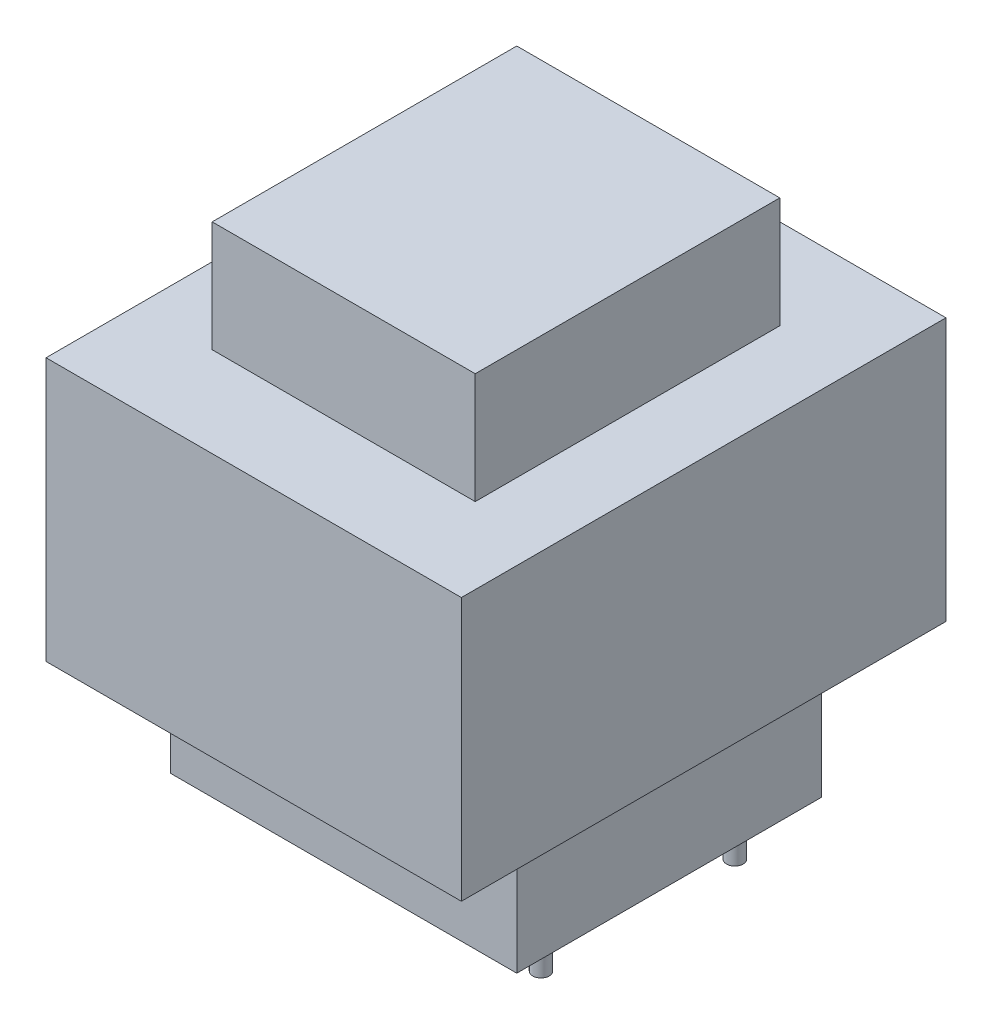
ISO-10303-21;
HEADER;
FILE_DESCRIPTION(('STEP AP214'),'2;1');
FILE_NAME('part.step','',(''),(''),'','','');
FILE_SCHEMA(('AUTOMOTIVE_DESIGN { 1 0 10303 214 1 1 1 1 }'));
ENDSEC;
DATA;
#1=APPLICATION_CONTEXT('core data for automotive mechanical design processes');
#2=APPLICATION_PROTOCOL_DEFINITION('international standard','automotive_design',2000,#1);
#3=PRODUCT_CONTEXT('',#1,'mechanical');
#4=PRODUCT('Part','Part','',(#3));
#5=PRODUCT_RELATED_PRODUCT_CATEGORY('part','',(#4));
#6=PRODUCT_DEFINITION_FORMATION('','',#4);
#7=PRODUCT_DEFINITION_CONTEXT('part definition',#1,'design');
#8=PRODUCT_DEFINITION('design','',#6,#7);
#9=PRODUCT_DEFINITION_SHAPE('','',#8);
#10=(LENGTH_UNIT() NAMED_UNIT(*) SI_UNIT(.MILLI.,.METRE.));
#11=(NAMED_UNIT(*) PLANE_ANGLE_UNIT() SI_UNIT($,.RADIAN.));
#12=(NAMED_UNIT(*) SI_UNIT($,.STERADIAN.) SOLID_ANGLE_UNIT());
#13=UNCERTAINTY_MEASURE_WITH_UNIT(LENGTH_MEASURE(1.E-05),#10,'distance_accuracy_value','');
#14=(GEOMETRIC_REPRESENTATION_CONTEXT(3) GLOBAL_UNCERTAINTY_ASSIGNED_CONTEXT((#13)) GLOBAL_UNIT_ASSIGNED_CONTEXT((#10,
#11,#12)) REPRESENTATION_CONTEXT('',''));
#15=CARTESIAN_POINT('',(0.,0.,0.));
#16=DIRECTION('',(0.,0.,1.));
#17=DIRECTION('',(1.,0.,0.));
#18=AXIS2_PLACEMENT_3D('',#15,#16,#17);
#19=CARTESIAN_POINT('',(-12.5,9.,-11.));
#20=DIRECTION('',(0.,0.,1.));
#21=DIRECTION('',(1.,0.,0.));
#22=AXIS2_PLACEMENT_3D('',#19,#20,#21);
#23=PLANE('',#22);
#24=DIRECTION('',(0.,-1.,0.));
#25=VECTOR('',#24,1.);
#26=CARTESIAN_POINT('',(-12.5,9.,-11.));
#27=LINE('',#26,#25);
#28=CARTESIAN_POINT('',(-12.5,9.,-11.));
#29=VERTEX_POINT('',#28);
#30=CARTESIAN_POINT('',(-12.5,0.,-11.));
#31=VERTEX_POINT('',#30);
#32=EDGE_CURVE('E43',#29,#31,#27,.T.);
#33=ORIENTED_EDGE('',*,*,#32,.F.);
#34=DIRECTION('',(-1.,0.,0.));
#35=VECTOR('',#34,1.);
#36=CARTESIAN_POINT('',(-12.5,9.,-11.));
#37=LINE('',#36,#35);
#38=CARTESIAN_POINT('',(12.5,9.,-11.));
#39=VERTEX_POINT('',#38);
#40=EDGE_CURVE('E84',#39,#29,#37,.T.);
#41=ORIENTED_EDGE('',*,*,#40,.F.);
#42=DIRECTION('',(0.,-1.,0.));
#43=VECTOR('',#42,1.);
#44=CARTESIAN_POINT('',(12.5,9.,-11.));
#45=LINE('',#44,#43);
#46=CARTESIAN_POINT('',(12.5,0.,-11.));
#47=VERTEX_POINT('',#46);
#48=EDGE_CURVE('E11',#39,#47,#45,.T.);
#49=ORIENTED_EDGE('',*,*,#48,.T.);
#50=DIRECTION('',(-1.,0.,0.));
#51=VECTOR('',#50,1.);
#52=CARTESIAN_POINT('',(-12.5,0.,-11.));
#53=LINE('',#52,#51);
#54=EDGE_CURVE('E180',#47,#31,#53,.T.);
#55=ORIENTED_EDGE('',*,*,#54,.T.);
#56=EDGE_LOOP('',(#33,#41,#49,#55));
#57=FACE_BOUND('',#56,.T.);
#58=ADVANCED_FACE('F35',(#57),#23,.F.);
#59=CARTESIAN_POINT('',(-12.5,9.,11.));
#60=DIRECTION('',(0.,0.,-1.));
#61=DIRECTION('',(-1.,0.,0.));
#62=AXIS2_PLACEMENT_3D('',#59,#60,#61);
#63=PLANE('',#62);
#64=DIRECTION('',(0.,-1.,0.));
#65=VECTOR('',#64,1.);
#66=CARTESIAN_POINT('',(12.5,9.,11.));
#67=LINE('',#66,#65);
#68=CARTESIAN_POINT('',(12.5,9.,11.));
#69=VERTEX_POINT('',#68);
#70=CARTESIAN_POINT('',(12.5,0.,11.));
#71=VERTEX_POINT('',#70);
#72=EDGE_CURVE('E177',#69,#71,#67,.T.);
#73=ORIENTED_EDGE('',*,*,#72,.F.);
#74=DIRECTION('',(1.,0.,0.));
#75=VECTOR('',#74,1.);
#76=CARTESIAN_POINT('',(-12.5,9.,11.));
#77=LINE('',#76,#75);
#78=CARTESIAN_POINT('',(-12.5,9.,11.));
#79=VERTEX_POINT('',#78);
#80=EDGE_CURVE('E175',#79,#69,#77,.T.);
#81=ORIENTED_EDGE('',*,*,#80,.F.);
#82=DIRECTION('',(0.,-1.,0.));
#83=VECTOR('',#82,1.);
#84=CARTESIAN_POINT('',(-12.5,9.,11.));
#85=LINE('',#84,#83);
#86=CARTESIAN_POINT('',(-12.5,0.,11.));
#87=VERTEX_POINT('',#86);
#88=EDGE_CURVE('E59',#79,#87,#85,.T.);
#89=ORIENTED_EDGE('',*,*,#88,.T.);
#90=DIRECTION('',(1.,0.,0.));
#91=VECTOR('',#90,1.);
#92=CARTESIAN_POINT('',(-12.5,0.,11.));
#93=LINE('',#92,#91);
#94=EDGE_CURVE('E79',#87,#71,#93,.T.);
#95=ORIENTED_EDGE('',*,*,#94,.T.);
#96=EDGE_LOOP('',(#73,#81,#89,#95));
#97=FACE_BOUND('',#96,.T.);
#98=ADVANCED_FACE('F194',(#97),#63,.F.);
#99=CARTESIAN_POINT('',(12.5,9.,11.));
#100=DIRECTION('',(-1.,0.,0.));
#101=DIRECTION('',(0.,0.,1.));
#102=AXIS2_PLACEMENT_3D('',#99,#100,#101);
#103=PLANE('',#102);
#104=DIRECTION('',(0.,0.,-1.));
#105=VECTOR('',#104,1.);
#106=CARTESIAN_POINT('',(12.5,0.,11.));
#107=LINE('',#106,#105);
#108=EDGE_CURVE('E167',#71,#47,#107,.T.);
#109=ORIENTED_EDGE('',*,*,#108,.T.);
#110=ORIENTED_EDGE('',*,*,#48,.F.);
#111=DIRECTION('',(0.,0.,-1.));
#112=VECTOR('',#111,1.);
#113=CARTESIAN_POINT('',(12.5,9.,11.));
#114=LINE('',#113,#112);
#115=EDGE_CURVE('E168',#69,#39,#114,.T.);
#116=ORIENTED_EDGE('',*,*,#115,.F.);
#117=ORIENTED_EDGE('',*,*,#72,.T.);
#118=EDGE_LOOP('',(#109,#110,#116,#117));
#119=FACE_BOUND('',#118,.T.);
#120=ADVANCED_FACE('F37',(#119),#103,.F.);
#121=CARTESIAN_POINT('',(-12.5,9.,11.));
#122=DIRECTION('',(1.,0.,0.));
#123=DIRECTION('',(0.,0.,-1.));
#124=AXIS2_PLACEMENT_3D('',#121,#122,#123);
#125=PLANE('',#124);
#126=DIRECTION('',(0.,0.,1.));
#127=VECTOR('',#126,1.);
#128=CARTESIAN_POINT('',(-12.5,0.,11.));
#129=LINE('',#128,#127);
#130=EDGE_CURVE('E182',#31,#87,#129,.T.);
#131=ORIENTED_EDGE('',*,*,#130,.T.);
#132=ORIENTED_EDGE('',*,*,#88,.F.);
#133=DIRECTION('',(0.,0.,1.));
#134=VECTOR('',#133,1.);
#135=CARTESIAN_POINT('',(-12.5,9.,11.));
#136=LINE('',#135,#134);
#137=EDGE_CURVE('E172',#29,#79,#136,.T.);
#138=ORIENTED_EDGE('',*,*,#137,.F.);
#139=ORIENTED_EDGE('',*,*,#32,.T.);
#140=EDGE_LOOP('',(#131,#132,#138,#139));
#141=FACE_BOUND('',#140,.T.);
#142=ADVANCED_FACE('F188',(#141),#125,.F.);
#143=CARTESIAN_POINT('',(0.,0.,0.));
#144=DIRECTION('',(0.,-1.,0.));
#145=DIRECTION('',(0.,0.,-1.));
#146=AXIS2_PLACEMENT_3D('',#143,#144,#145);
#147=PLANE('',#146);
#148=CARTESIAN_POINT('',(-10.25,0.,0.));
#149=DIRECTION('',(0.,-1.,0.));
#150=DIRECTION('',(0.,0.,-1.));
#151=AXIS2_PLACEMENT_3D('',#148,#149,#150);
#152=CIRCLE('',#151,0.6);
#153=CARTESIAN_POINT('',(-10.25,0.,-0.599999999999998));
#154=VERTEX_POINT('',#153);
#155=EDGE_CURVE('E272',#154,#154,#152,.T.);
#156=ORIENTED_EDGE('',*,*,#155,.F.);
#157=EDGE_LOOP('',(#156));
#158=FACE_BOUND('',#157,.T.);
#159=CARTESIAN_POINT('',(-10.25,0.,-7.));
#160=DIRECTION('',(0.,-1.,0.));
#161=DIRECTION('',(0.,0.,-1.));
#162=AXIS2_PLACEMENT_3D('',#159,#160,#161);
#163=CIRCLE('',#162,0.6);
#164=CARTESIAN_POINT('',(-10.25,0.,-7.6));
#165=VERTEX_POINT('',#164);
#166=EDGE_CURVE('E276',#165,#165,#163,.T.);
#167=ORIENTED_EDGE('',*,*,#166,.F.);
#168=EDGE_LOOP('',(#167));
#169=FACE_BOUND('',#168,.T.);
#170=CARTESIAN_POINT('',(-10.25,0.,7.));
#171=DIRECTION('',(0.,-1.,0.));
#172=DIRECTION('',(0.,0.,-1.));
#173=AXIS2_PLACEMENT_3D('',#170,#171,#172);
#174=CIRCLE('',#173,0.6);
#175=CARTESIAN_POINT('',(-10.25,0.,6.4));
#176=VERTEX_POINT('',#175);
#177=EDGE_CURVE('E282',#176,#176,#174,.T.);
#178=ORIENTED_EDGE('',*,*,#177,.F.);
#179=EDGE_LOOP('',(#178));
#180=FACE_BOUND('',#179,.T.);
#181=CARTESIAN_POINT('',(10.25,0.,7.));
#182=DIRECTION('',(0.,-1.,0.));
#183=DIRECTION('',(0.,0.,-1.));
#184=AXIS2_PLACEMENT_3D('',#181,#182,#183);
#185=CIRCLE('',#184,0.6);
#186=CARTESIAN_POINT('',(10.25,0.,6.4));
#187=VERTEX_POINT('',#186);
#188=EDGE_CURVE('E288',#187,#187,#185,.T.);
#189=ORIENTED_EDGE('',*,*,#188,.F.);
#190=EDGE_LOOP('',(#189));
#191=FACE_BOUND('',#190,.T.);
#192=CARTESIAN_POINT('',(10.25,0.,-7.));
#193=DIRECTION('',(0.,-1.,0.));
#194=DIRECTION('',(0.,0.,-1.));
#195=AXIS2_PLACEMENT_3D('',#192,#193,#194);
#196=CIRCLE('',#195,0.6);
#197=CARTESIAN_POINT('',(10.25,0.,-7.6));
#198=VERTEX_POINT('',#197);
#199=EDGE_CURVE('E235',#198,#198,#196,.T.);
#200=ORIENTED_EDGE('',*,*,#199,.F.);
#201=EDGE_LOOP('',(#200));
#202=FACE_BOUND('',#201,.T.);
#203=ORIENTED_EDGE('',*,*,#108,.F.);
#204=ORIENTED_EDGE('',*,*,#94,.F.);
#205=ORIENTED_EDGE('',*,*,#130,.F.);
#206=ORIENTED_EDGE('',*,*,#54,.F.);
#207=EDGE_LOOP('',(#203,#204,#205,#206));
#208=FACE_BOUND('',#207,.T.);
#209=ADVANCED_FACE('F191',(#158,#169,#180,#191,#202,#208),#147,.T.);
#210=CARTESIAN_POINT('',(10.25,-3.,-7.));
#211=DIRECTION('',(0.,1.,0.));
#212=DIRECTION('',(0.,0.,1.));
#213=AXIS2_PLACEMENT_3D('',#210,#211,#212);
#214=CYLINDRICAL_SURFACE('',#213,0.6);
#215=CARTESIAN_POINT('',(10.25,-3.,-7.));
#216=DIRECTION('',(0.,-1.,0.));
#217=DIRECTION('',(0.,0.,-1.));
#218=AXIS2_PLACEMENT_3D('',#215,#216,#217);
#219=CIRCLE('',#218,0.6);
#220=CARTESIAN_POINT('',(10.25,-3.,-7.6));
#221=VERTEX_POINT('',#220);
#222=EDGE_CURVE('E232',#221,#221,#219,.T.);
#223=ORIENTED_EDGE('',*,*,#222,.F.);
#224=EDGE_LOOP('',(#223));
#225=FACE_BOUND('',#224,.T.);
#226=ORIENTED_EDGE('',*,*,#199,.T.);
#227=EDGE_LOOP('',(#226));
#228=FACE_BOUND('',#227,.T.);
#229=ADVANCED_FACE('F301',(#225,#228),#214,.T.);
#230=CARTESIAN_POINT('',(10.25,-3.,-7.));
#231=DIRECTION('',(0.,-1.,0.));
#232=DIRECTION('',(0.,0.,-1.));
#233=AXIS2_PLACEMENT_3D('',#230,#231,#232);
#234=PLANE('',#233);
#235=ORIENTED_EDGE('',*,*,#222,.T.);
#236=EDGE_LOOP('',(#235));
#237=FACE_BOUND('',#236,.T.);
#238=ADVANCED_FACE('F308',(#237),#234,.T.);
#239=CARTESIAN_POINT('',(10.25,-3.,7.));
#240=DIRECTION('',(0.,1.,0.));
#241=DIRECTION('',(0.,0.,1.));
#242=AXIS2_PLACEMENT_3D('',#239,#240,#241);
#243=CYLINDRICAL_SURFACE('',#242,0.6);
#244=CARTESIAN_POINT('',(10.25,-3.,7.));
#245=DIRECTION('',(0.,-1.,0.));
#246=DIRECTION('',(0.,0.,-1.));
#247=AXIS2_PLACEMENT_3D('',#244,#245,#246);
#248=CIRCLE('',#247,0.6);
#249=CARTESIAN_POINT('',(10.25,-3.,6.4));
#250=VERTEX_POINT('',#249);
#251=EDGE_CURVE('E291',#250,#250,#248,.T.);
#252=ORIENTED_EDGE('',*,*,#251,.F.);
#253=EDGE_LOOP('',(#252));
#254=FACE_BOUND('',#253,.T.);
#255=ORIENTED_EDGE('',*,*,#188,.T.);
#256=EDGE_LOOP('',(#255));
#257=FACE_BOUND('',#256,.T.);
#258=ADVANCED_FACE('F297',(#254,#257),#243,.T.);
#259=CARTESIAN_POINT('',(10.25,-3.,7.));
#260=DIRECTION('',(0.,-1.,0.));
#261=DIRECTION('',(0.,0.,-1.));
#262=AXIS2_PLACEMENT_3D('',#259,#260,#261);
#263=PLANE('',#262);
#264=ORIENTED_EDGE('',*,*,#251,.T.);
#265=EDGE_LOOP('',(#264));
#266=FACE_BOUND('',#265,.T.);
#267=ADVANCED_FACE('F397',(#266),#263,.T.);
#268=CARTESIAN_POINT('',(-10.25,-3.,7.));
#269=DIRECTION('',(0.,1.,0.));
#270=DIRECTION('',(0.,0.,1.));
#271=AXIS2_PLACEMENT_3D('',#268,#269,#270);
#272=CYLINDRICAL_SURFACE('',#271,0.6);
#273=CARTESIAN_POINT('',(-10.25,-3.,7.));
#274=DIRECTION('',(0.,-1.,0.));
#275=DIRECTION('',(0.,0.,-1.));
#276=AXIS2_PLACEMENT_3D('',#273,#274,#275);
#277=CIRCLE('',#276,0.6);
#278=CARTESIAN_POINT('',(-10.25,-3.,6.4));
#279=VERTEX_POINT('',#278);
#280=EDGE_CURVE('E285',#279,#279,#277,.T.);
#281=ORIENTED_EDGE('',*,*,#280,.F.);
#282=EDGE_LOOP('',(#281));
#283=FACE_BOUND('',#282,.T.);
#284=ORIENTED_EDGE('',*,*,#177,.T.);
#285=EDGE_LOOP('',(#284));
#286=FACE_BOUND('',#285,.T.);
#287=ADVANCED_FACE('F387',(#283,#286),#272,.T.);
#288=CARTESIAN_POINT('',(-10.25,-3.,7.));
#289=DIRECTION('',(0.,-1.,0.));
#290=DIRECTION('',(0.,0.,-1.));
#291=AXIS2_PLACEMENT_3D('',#288,#289,#290);
#292=PLANE('',#291);
#293=ORIENTED_EDGE('',*,*,#280,.T.);
#294=EDGE_LOOP('',(#293));
#295=FACE_BOUND('',#294,.T.);
#296=ADVANCED_FACE('F377',(#295),#292,.T.);
#297=CARTESIAN_POINT('',(-10.25,-3.,-7.));
#298=DIRECTION('',(0.,1.,0.));
#299=DIRECTION('',(0.,0.,1.));
#300=AXIS2_PLACEMENT_3D('',#297,#298,#299);
#301=CYLINDRICAL_SURFACE('',#300,0.6);
#302=CARTESIAN_POINT('',(-10.25,-3.,-7.));
#303=DIRECTION('',(0.,-1.,0.));
#304=DIRECTION('',(0.,0.,-1.));
#305=AXIS2_PLACEMENT_3D('',#302,#303,#304);
#306=CIRCLE('',#305,0.6);
#307=CARTESIAN_POINT('',(-10.25,-3.,-7.6));
#308=VERTEX_POINT('',#307);
#309=EDGE_CURVE('E279',#308,#308,#306,.T.);
#310=ORIENTED_EDGE('',*,*,#309,.F.);
#311=EDGE_LOOP('',(#310));
#312=FACE_BOUND('',#311,.T.);
#313=ORIENTED_EDGE('',*,*,#166,.T.);
#314=EDGE_LOOP('',(#313));
#315=FACE_BOUND('',#314,.T.);
#316=ADVANCED_FACE('F367',(#312,#315),#301,.T.);
#317=CARTESIAN_POINT('',(-10.25,-3.,-7.));
#318=DIRECTION('',(0.,-1.,0.));
#319=DIRECTION('',(0.,0.,-1.));
#320=AXIS2_PLACEMENT_3D('',#317,#318,#319);
#321=PLANE('',#320);
#322=ORIENTED_EDGE('',*,*,#309,.T.);
#323=EDGE_LOOP('',(#322));
#324=FACE_BOUND('',#323,.T.);
#325=ADVANCED_FACE('F357',(#324),#321,.T.);
#326=CARTESIAN_POINT('',(-10.25,-3.,0.));
#327=DIRECTION('',(0.,1.,0.));
#328=DIRECTION('',(0.,0.,1.));
#329=AXIS2_PLACEMENT_3D('',#326,#327,#328);
#330=CYLINDRICAL_SURFACE('',#329,0.6);
#331=CARTESIAN_POINT('',(-10.25,-3.,0.));
#332=DIRECTION('',(0.,-1.,0.));
#333=DIRECTION('',(0.,0.,-1.));
#334=AXIS2_PLACEMENT_3D('',#331,#332,#333);
#335=CIRCLE('',#334,0.6);
#336=CARTESIAN_POINT('',(-10.25,-3.,-0.599999999999998));
#337=VERTEX_POINT('',#336);
#338=EDGE_CURVE('E273',#337,#337,#335,.T.);
#339=ORIENTED_EDGE('',*,*,#338,.F.);
#340=EDGE_LOOP('',(#339));
#341=FACE_BOUND('',#340,.T.);
#342=ORIENTED_EDGE('',*,*,#155,.T.);
#343=EDGE_LOOP('',(#342));
#344=FACE_BOUND('',#343,.T.);
#345=ADVANCED_FACE('F208',(#341,#344),#330,.T.);
#346=CARTESIAN_POINT('',(-10.25,-3.,0.));
#347=DIRECTION('',(0.,-1.,0.));
#348=DIRECTION('',(0.,0.,-1.));
#349=AXIS2_PLACEMENT_3D('',#346,#347,#348);
#350=PLANE('',#349);
#351=ORIENTED_EDGE('',*,*,#338,.T.);
#352=EDGE_LOOP('',(#351));
#353=FACE_BOUND('',#352,.T.);
#354=ADVANCED_FACE('F198',(#353),#350,.T.);
#355=CARTESIAN_POINT('',(0.,9.,0.));
#356=DIRECTION('',(0.,1.,0.));
#357=DIRECTION('',(0.,0.,1.));
#358=AXIS2_PLACEMENT_3D('',#355,#356,#357);
#359=PLANE('',#358);
#360=DIRECTION('',(0.,0.,1.));
#361=VECTOR('',#360,1.);
#362=CARTESIAN_POINT('',(-15.,9.,17.5));
#363=LINE('',#362,#361);
#364=CARTESIAN_POINT('',(-15.,9.,-17.5));
#365=VERTEX_POINT('',#364);
#366=CARTESIAN_POINT('',(-15.,9.,17.5));
#367=VERTEX_POINT('',#366);
#368=EDGE_CURVE('E242',#365,#367,#363,.T.);
#369=ORIENTED_EDGE('',*,*,#368,.F.);
#370=DIRECTION('',(-1.,0.,0.));
#371=VECTOR('',#370,1.);
#372=CARTESIAN_POINT('',(15.,9.,-17.5));
#373=LINE('',#372,#371);
#374=CARTESIAN_POINT('',(15.,9.,-17.5));
#375=VERTEX_POINT('',#374);
#376=EDGE_CURVE('E247',#375,#365,#373,.T.);
#377=ORIENTED_EDGE('',*,*,#376,.F.);
#378=DIRECTION('',(0.,0.,-1.));
#379=VECTOR('',#378,1.);
#380=CARTESIAN_POINT('',(15.,9.,17.5));
#381=LINE('',#380,#379);
#382=CARTESIAN_POINT('',(15.,9.,17.5));
#383=VERTEX_POINT('',#382);
#384=EDGE_CURVE('E258',#383,#375,#381,.T.);
#385=ORIENTED_EDGE('',*,*,#384,.F.);
#386=DIRECTION('',(1.,0.,0.));
#387=VECTOR('',#386,1.);
#388=CARTESIAN_POINT('',(15.,9.,17.5));
#389=LINE('',#388,#387);
#390=EDGE_CURVE('E256',#367,#383,#389,.T.);
#391=ORIENTED_EDGE('',*,*,#390,.F.);
#392=EDGE_LOOP('',(#369,#377,#385,#391));
#393=FACE_BOUND('',#392,.T.);
#394=ORIENTED_EDGE('',*,*,#40,.T.);
#395=ORIENTED_EDGE('',*,*,#137,.T.);
#396=ORIENTED_EDGE('',*,*,#80,.T.);
#397=ORIENTED_EDGE('',*,*,#115,.T.);
#398=EDGE_LOOP('',(#394,#395,#396,#397));
#399=FACE_BOUND('',#398,.T.);
#400=ADVANCED_FACE('F196',(#393,#399),#359,.F.);
#401=CARTESIAN_POINT('',(0.,28.,0.));
#402=DIRECTION('',(0.,1.,0.));
#403=DIRECTION('',(0.,0.,1.));
#404=AXIS2_PLACEMENT_3D('',#401,#402,#403);
#405=PLANE('',#404);
#406=DIRECTION('',(0.,0.,1.));
#407=VECTOR('',#406,1.);
#408=CARTESIAN_POINT('',(-15.,28.,17.5));
#409=LINE('',#408,#407);
#410=CARTESIAN_POINT('',(-15.,28.,-17.5));
#411=VERTEX_POINT('',#410);
#412=CARTESIAN_POINT('',(-15.,28.,17.5));
#413=VERTEX_POINT('',#412);
#414=EDGE_CURVE('E243',#411,#413,#409,.T.);
#415=ORIENTED_EDGE('',*,*,#414,.T.);
#416=DIRECTION('',(1.,0.,0.));
#417=VECTOR('',#416,1.);
#418=CARTESIAN_POINT('',(15.,28.,17.5));
#419=LINE('',#418,#417);
#420=CARTESIAN_POINT('',(15.,28.,17.5));
#421=VERTEX_POINT('',#420);
#422=EDGE_CURVE('E246',#413,#421,#419,.T.);
#423=ORIENTED_EDGE('',*,*,#422,.T.);
#424=DIRECTION('',(0.,0.,-1.));
#425=VECTOR('',#424,1.);
#426=CARTESIAN_POINT('',(15.,28.,17.5));
#427=LINE('',#426,#425);
#428=CARTESIAN_POINT('',(15.,28.,-17.5));
#429=VERTEX_POINT('',#428);
#430=EDGE_CURVE('E249',#421,#429,#427,.T.);
#431=ORIENTED_EDGE('',*,*,#430,.T.);
#432=DIRECTION('',(-1.,0.,0.));
#433=VECTOR('',#432,1.);
#434=CARTESIAN_POINT('',(15.,28.,-17.5));
#435=LINE('',#434,#433);
#436=EDGE_CURVE('E251',#429,#411,#435,.T.);
#437=ORIENTED_EDGE('',*,*,#436,.T.);
#438=EDGE_LOOP('',(#415,#423,#431,#437));
#439=FACE_BOUND('',#438,.T.);
#440=DIRECTION('',(1.,0.,0.));
#441=VECTOR('',#440,1.);
#442=CARTESIAN_POINT('',(9.5,28.,11.));
#443=LINE('',#442,#441);
#444=CARTESIAN_POINT('',(-9.5,28.,11.));
#445=VERTEX_POINT('',#444);
#446=CARTESIAN_POINT('',(9.5,28.,11.));
#447=VERTEX_POINT('',#446);
#448=EDGE_CURVE('E50',#445,#447,#443,.T.);
#449=ORIENTED_EDGE('',*,*,#448,.F.);
#450=DIRECTION('',(0.,0.,1.));
#451=VECTOR('',#450,1.);
#452=CARTESIAN_POINT('',(-9.5,28.,11.));
#453=LINE('',#452,#451);
#454=CARTESIAN_POINT('',(-9.5,28.,-11.));
#455=VERTEX_POINT('',#454);
#456=EDGE_CURVE('E150',#455,#445,#453,.T.);
#457=ORIENTED_EDGE('',*,*,#456,.F.);
#458=DIRECTION('',(-1.,0.,0.));
#459=VECTOR('',#458,1.);
#460=CARTESIAN_POINT('',(9.5,28.,-11.));
#461=LINE('',#460,#459);
#462=CARTESIAN_POINT('',(9.5,28.,-11.));
#463=VERTEX_POINT('',#462);
#464=EDGE_CURVE('E135',#463,#455,#461,.T.);
#465=ORIENTED_EDGE('',*,*,#464,.F.);
#466=DIRECTION('',(0.,0.,-1.));
#467=VECTOR('',#466,1.);
#468=CARTESIAN_POINT('',(9.5,28.,11.));
#469=LINE('',#468,#467);
#470=EDGE_CURVE('E132',#447,#463,#469,.T.);
#471=ORIENTED_EDGE('',*,*,#470,.F.);
#472=EDGE_LOOP('',(#449,#457,#465,#471));
#473=FACE_BOUND('',#472,.T.);
#474=ADVANCED_FACE('F133',(#439,#473),#405,.T.);
#475=CARTESIAN_POINT('',(-15.,28.,17.5));
#476=DIRECTION('',(1.,0.,0.));
#477=DIRECTION('',(0.,0.,-1.));
#478=AXIS2_PLACEMENT_3D('',#475,#476,#477);
#479=PLANE('',#478);
#480=ORIENTED_EDGE('',*,*,#368,.T.);
#481=DIRECTION('',(0.,-1.,0.));
#482=VECTOR('',#481,1.);
#483=CARTESIAN_POINT('',(-15.,28.,17.5));
#484=LINE('',#483,#482);
#485=EDGE_CURVE('E269',#413,#367,#484,.T.);
#486=ORIENTED_EDGE('',*,*,#485,.F.);
#487=ORIENTED_EDGE('',*,*,#414,.F.);
#488=DIRECTION('',(0.,-1.,0.));
#489=VECTOR('',#488,1.);
#490=CARTESIAN_POINT('',(-15.,28.,-17.5));
#491=LINE('',#490,#489);
#492=EDGE_CURVE('E253',#411,#365,#491,.T.);
#493=ORIENTED_EDGE('',*,*,#492,.T.);
#494=EDGE_LOOP('',(#480,#486,#487,#493));
#495=FACE_BOUND('',#494,.T.);
#496=ADVANCED_FACE('F205',(#495),#479,.F.);
#497=CARTESIAN_POINT('',(15.,28.,17.5));
#498=DIRECTION('',(0.,0.,-1.));
#499=DIRECTION('',(-1.,0.,0.));
#500=AXIS2_PLACEMENT_3D('',#497,#498,#499);
#501=PLANE('',#500);
#502=ORIENTED_EDGE('',*,*,#390,.T.);
#503=DIRECTION('',(0.,-1.,0.));
#504=VECTOR('',#503,1.);
#505=CARTESIAN_POINT('',(15.,28.,17.5));
#506=LINE('',#505,#504);
#507=EDGE_CURVE('E266',#421,#383,#506,.T.);
#508=ORIENTED_EDGE('',*,*,#507,.F.);
#509=ORIENTED_EDGE('',*,*,#422,.F.);
#510=ORIENTED_EDGE('',*,*,#485,.T.);
#511=EDGE_LOOP('',(#502,#508,#509,#510));
#512=FACE_BOUND('',#511,.T.);
#513=ADVANCED_FACE('F489',(#512),#501,.F.);
#514=CARTESIAN_POINT('',(15.,28.,17.5));
#515=DIRECTION('',(-1.,0.,0.));
#516=DIRECTION('',(0.,0.,1.));
#517=AXIS2_PLACEMENT_3D('',#514,#515,#516);
#518=PLANE('',#517);
#519=ORIENTED_EDGE('',*,*,#384,.T.);
#520=DIRECTION('',(0.,-1.,0.));
#521=VECTOR('',#520,1.);
#522=CARTESIAN_POINT('',(15.,28.,-17.5));
#523=LINE('',#522,#521);
#524=EDGE_CURVE('E263',#429,#375,#523,.T.);
#525=ORIENTED_EDGE('',*,*,#524,.F.);
#526=ORIENTED_EDGE('',*,*,#430,.F.);
#527=ORIENTED_EDGE('',*,*,#507,.T.);
#528=EDGE_LOOP('',(#519,#525,#526,#527));
#529=FACE_BOUND('',#528,.T.);
#530=ADVANCED_FACE('F499',(#529),#518,.F.);
#531=CARTESIAN_POINT('',(15.,28.,-17.5));
#532=DIRECTION('',(0.,0.,1.));
#533=DIRECTION('',(1.,0.,0.));
#534=AXIS2_PLACEMENT_3D('',#531,#532,#533);
#535=PLANE('',#534);
#536=ORIENTED_EDGE('',*,*,#376,.T.);
#537=ORIENTED_EDGE('',*,*,#492,.F.);
#538=ORIENTED_EDGE('',*,*,#436,.F.);
#539=ORIENTED_EDGE('',*,*,#524,.T.);
#540=EDGE_LOOP('',(#536,#537,#538,#539));
#541=FACE_BOUND('',#540,.T.);
#542=ADVANCED_FACE('F321',(#541),#535,.F.);
#543=CARTESIAN_POINT('',(0.,36.,0.));
#544=DIRECTION('',(0.,-1.,0.));
#545=DIRECTION('',(0.,0.,-1.));
#546=AXIS2_PLACEMENT_3D('',#543,#544,#545);
#547=PLANE('',#546);
#548=DIRECTION('',(0.,0.,-1.));
#549=VECTOR('',#548,1.);
#550=CARTESIAN_POINT('',(9.5,36.,11.));
#551=LINE('',#550,#549);
#552=CARTESIAN_POINT('',(9.5,36.,11.));
#553=VERTEX_POINT('',#552);
#554=CARTESIAN_POINT('',(9.5,36.,-11.));
#555=VERTEX_POINT('',#554);
#556=EDGE_CURVE('E154',#553,#555,#551,.T.);
#557=ORIENTED_EDGE('',*,*,#556,.T.);
#558=DIRECTION('',(-1.,0.,0.));
#559=VECTOR('',#558,1.);
#560=CARTESIAN_POINT('',(-9.5,36.,-11.));
#561=LINE('',#560,#559);
#562=CARTESIAN_POINT('',(-9.5,36.,-11.));
#563=VERTEX_POINT('',#562);
#564=EDGE_CURVE('E227',#555,#563,#561,.T.);
#565=ORIENTED_EDGE('',*,*,#564,.T.);
#566=DIRECTION('',(0.,0.,1.));
#567=VECTOR('',#566,1.);
#568=CARTESIAN_POINT('',(-9.5,36.,11.));
#569=LINE('',#568,#567);
#570=CARTESIAN_POINT('',(-9.5,36.,11.));
#571=VERTEX_POINT('',#570);
#572=EDGE_CURVE('E159',#563,#571,#569,.T.);
#573=ORIENTED_EDGE('',*,*,#572,.T.);
#574=DIRECTION('',(1.,0.,0.));
#575=VECTOR('',#574,1.);
#576=CARTESIAN_POINT('',(-9.5,36.,11.));
#577=LINE('',#576,#575);
#578=EDGE_CURVE('E155',#571,#553,#577,.T.);
#579=ORIENTED_EDGE('',*,*,#578,.T.);
#580=EDGE_LOOP('',(#557,#565,#573,#579));
#581=FACE_BOUND('',#580,.T.);
#582=ADVANCED_FACE('F231',(#581),#547,.F.);
#583=CARTESIAN_POINT('',(9.5,36.,11.));
#584=DIRECTION('',(-1.,0.,0.));
#585=DIRECTION('',(0.,0.,1.));
#586=AXIS2_PLACEMENT_3D('',#583,#584,#585);
#587=PLANE('',#586);
#588=DIRECTION('',(0.,-1.,0.));
#589=VECTOR('',#588,1.);
#590=CARTESIAN_POINT('',(9.5,36.,11.));
#591=LINE('',#590,#589);
#592=EDGE_CURVE('E146',#553,#447,#591,.T.);
#593=ORIENTED_EDGE('',*,*,#592,.T.);
#594=ORIENTED_EDGE('',*,*,#470,.T.);
#595=DIRECTION('',(0.,-1.,0.));
#596=VECTOR('',#595,1.);
#597=CARTESIAN_POINT('',(9.5,36.,-11.));
#598=LINE('',#597,#596);
#599=EDGE_CURVE('E165',#555,#463,#598,.T.);
#600=ORIENTED_EDGE('',*,*,#599,.F.);
#601=ORIENTED_EDGE('',*,*,#556,.F.);
#602=EDGE_LOOP('',(#593,#594,#600,#601));
#603=FACE_BOUND('',#602,.T.);
#604=ADVANCED_FACE('F152',(#603),#587,.F.);
#605=CARTESIAN_POINT('',(-9.5,36.,11.));
#606=DIRECTION('',(1.,0.,0.));
#607=DIRECTION('',(0.,0.,-1.));
#608=AXIS2_PLACEMENT_3D('',#605,#606,#607);
#609=PLANE('',#608);
#610=DIRECTION('',(0.,-1.,0.));
#611=VECTOR('',#610,1.);
#612=CARTESIAN_POINT('',(-9.5,36.,-11.));
#613=LINE('',#612,#611);
#614=EDGE_CURVE('E157',#563,#455,#613,.T.);
#615=ORIENTED_EDGE('',*,*,#614,.T.);
#616=ORIENTED_EDGE('',*,*,#456,.T.);
#617=DIRECTION('',(0.,-1.,0.));
#618=VECTOR('',#617,1.);
#619=CARTESIAN_POINT('',(-9.5,36.,11.));
#620=LINE('',#619,#618);
#621=EDGE_CURVE('E149',#571,#445,#620,.T.);
#622=ORIENTED_EDGE('',*,*,#621,.F.);
#623=ORIENTED_EDGE('',*,*,#572,.F.);
#624=EDGE_LOOP('',(#615,#616,#622,#623));
#625=FACE_BOUND('',#624,.T.);
#626=ADVANCED_FACE('F225',(#625),#609,.F.);
#627=ORIENTED_EDGE('',*,*,#621,.T.);
#628=ORIENTED_EDGE('',*,*,#448,.T.);
#629=ORIENTED_EDGE('',*,*,#592,.F.);
#630=ORIENTED_EDGE('',*,*,#578,.F.);
#631=EDGE_LOOP('',(#627,#628,#629,#630));
#632=FACE_BOUND('',#631,.T.);
#633=ADVANCED_FACE('F144',(#632),#63,.F.);
#634=ORIENTED_EDGE('',*,*,#599,.T.);
#635=ORIENTED_EDGE('',*,*,#464,.T.);
#636=ORIENTED_EDGE('',*,*,#614,.F.);
#637=ORIENTED_EDGE('',*,*,#564,.F.);
#638=EDGE_LOOP('',(#634,#635,#636,#637));
#639=FACE_BOUND('',#638,.T.);
#640=ADVANCED_FACE('F214',(#639),#23,.F.);
#641=CLOSED_SHELL('',(#58,#98,#120,#142,#209,#229,#238,#258,#267,#287,#296,#316,#325,#345,#354,
#400,#474,#496,#513,#530,#542,#582,#604,#626,#633,#640));
#642=MANIFOLD_SOLID_BREP('B2',#641);
#643=ADVANCED_BREP_SHAPE_REPRESENTATION('',(#18,#642),#14);
#644=SHAPE_DEFINITION_REPRESENTATION(#9,#643);
ENDSEC;
END-ISO-10303-21;
